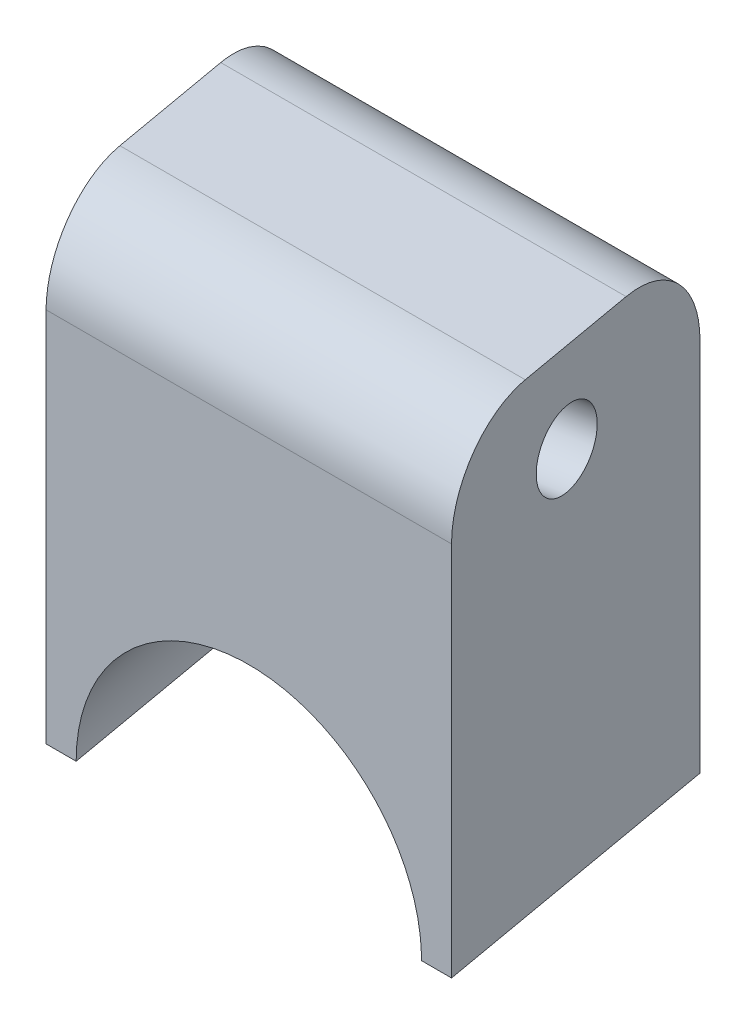
ISO-10303-21;
HEADER;
FILE_DESCRIPTION(('STEP AP214'),'2;1');
FILE_NAME('part.step','',(''),(''),'','','');
FILE_SCHEMA(('AUTOMOTIVE_DESIGN { 1 0 10303 214 1 1 1 1 }'));
ENDSEC;
DATA;
#1=APPLICATION_CONTEXT('core data for automotive mechanical design processes');
#2=APPLICATION_PROTOCOL_DEFINITION('international standard','automotive_design',2000,#1);
#3=PRODUCT_CONTEXT('',#1,'mechanical');
#4=PRODUCT('Part','Part','',(#3));
#5=PRODUCT_RELATED_PRODUCT_CATEGORY('part','',(#4));
#6=PRODUCT_DEFINITION_FORMATION('','',#4);
#7=PRODUCT_DEFINITION_CONTEXT('part definition',#1,'design');
#8=PRODUCT_DEFINITION('design','',#6,#7);
#9=PRODUCT_DEFINITION_SHAPE('','',#8);
#10=(LENGTH_UNIT() NAMED_UNIT(*) SI_UNIT(.MILLI.,.METRE.));
#11=(NAMED_UNIT(*) PLANE_ANGLE_UNIT() SI_UNIT($,.RADIAN.));
#12=(NAMED_UNIT(*) SI_UNIT($,.STERADIAN.) SOLID_ANGLE_UNIT());
#13=UNCERTAINTY_MEASURE_WITH_UNIT(LENGTH_MEASURE(1.E-05),#10,'distance_accuracy_value','');
#14=(GEOMETRIC_REPRESENTATION_CONTEXT(3) GLOBAL_UNCERTAINTY_ASSIGNED_CONTEXT((#13)) GLOBAL_UNIT_ASSIGNED_CONTEXT((#10,
#11,#12)) REPRESENTATION_CONTEXT('',''));
#15=CARTESIAN_POINT('',(0.,0.,0.));
#16=DIRECTION('',(0.,0.,1.));
#17=DIRECTION('',(1.,0.,0.));
#18=AXIS2_PLACEMENT_3D('',#15,#16,#17);
#19=CARTESIAN_POINT('',(0.,0.,0.));
#20=DIRECTION('',(0.,1.,0.));
#21=DIRECTION('',(0.,0.,1.));
#22=AXIS2_PLACEMENT_3D('',#19,#20,#21);
#23=PLANE('',#22);
#24=DIRECTION('',(0.173648177666931,0.,0.984807753012208));
#25=VECTOR('',#24,1.);
#26=CARTESIAN_POINT('',(33.0327464679226,0.,-40.30605787334));
#27=LINE('',#26,#25);
#28=CARTESIAN_POINT('',(33.9459209392839,0.,-35.1271880957697));
#29=VERTEX_POINT('',#28);
#30=CARTESIAN_POINT('',(36.9153047773884,0.,-18.2869755192609));
#31=VERTEX_POINT('',#30);
#32=EDGE_CURVE('E185',#29,#31,#27,.T.);
#33=ORIENTED_EDGE('',*,*,#32,.T.);
#34=DIRECTION('',(-1.,0.,0.));
#35=VECTOR('',#34,1.);
#36=CARTESIAN_POINT('',(57.884357590303,0.,-18.2869755192609));
#37=LINE('',#36,#35);
#38=CARTESIAN_POINT('',(35.239357590303,0.,-18.2869755192609));
#39=VERTEX_POINT('',#38);
#40=EDGE_CURVE('E140',#31,#39,#37,.T.);
#41=ORIENTED_EDGE('',*,*,#40,.T.);
#42=DIRECTION('',(0.173648177666927,0.,0.984807753012209));
#43=VECTOR('',#42,1.);
#44=CARTESIAN_POINT('',(37.3040179336186,0.,-6.57770485052927));
#45=LINE('',#44,#43);
#46=CARTESIAN_POINT('',(32.2699737521986,0.,-35.1271880957697));
#47=VERTEX_POINT('',#46);
#48=EDGE_CURVE('E153',#47,#39,#45,.T.);
#49=ORIENTED_EDGE('',*,*,#48,.F.);
#50=DIRECTION('',(1.,0.,0.));
#51=VECTOR('',#50,1.);
#52=CARTESIAN_POINT('',(0.,0.,-35.1271880957697));
#53=LINE('',#52,#51);
#54=EDGE_CURVE('E159',#47,#29,#53,.T.);
#55=ORIENTED_EDGE('',*,*,#54,.T.);
#56=EDGE_LOOP('',(#33,#41,#49,#55));
#57=FACE_BOUND('',#56,.T.);
#58=ADVANCED_FACE('F45',(#57),#23,.F.);
#59=CARTESIAN_POINT('',(37.3040179336186,26.,-6.57770485052927));
#60=DIRECTION('',(0.984807753012209,0.,-0.173648177666927));
#61=DIRECTION('',(-0.173648177666927,0.,-0.984807753012209));
#62=AXIS2_PLACEMENT_3D('',#59,#60,#61);
#63=PLANE('',#62);
#64=CARTESIAN_POINT('',(33.6704752940083,21.,-27.1845491633573));
#65=DIRECTION('',(-0.984807753012209,0.,0.173648177666927));
#66=DIRECTION('',(0.173648177666927,0.,0.984807753012209));
#67=AXIS2_PLACEMENT_3D('',#64,#65,#66);
#68=CIRCLE('',#67,2.1);
#69=CARTESIAN_POINT('',(34.0351364671089,21.,-25.1164528820317));
#70=VERTEX_POINT('',#69);
#71=EDGE_CURVE('E127',#70,#70,#68,.T.);
#72=ORIENTED_EDGE('',*,*,#71,.F.);
#73=EDGE_LOOP('',(#72));
#74=FACE_BOUND('',#73,.T.);
#75=DIRECTION('',(0.,1.,0.));
#76=VECTOR('',#75,1.);
#77=CARTESIAN_POINT('',(35.239357590303,0.,-18.2869755192609));
#78=LINE('',#77,#76);
#79=CARTESIAN_POINT('',(35.239357590303,21.,-18.2869755192609));
#80=VERTEX_POINT('',#79);
#81=EDGE_CURVE('E145',#39,#80,#78,.T.);
#82=ORIENTED_EDGE('',*,*,#81,.T.);
#83=CARTESIAN_POINT('',(34.3577226867607,21.,-23.2869755192609));
#84=DIRECTION('',(0.984807753012209,0.,-0.173648177666927));
#85=DIRECTION('',(0.173648177666927,0.,0.984807753012209));
#86=AXIS2_PLACEMENT_3D('',#83,#84,#85);
#87=ELLIPSE('',#86,5.07713305942872,5.);
#88=CARTESIAN_POINT('',(34.3577226867607,26.,-23.2869755192609));
#89=VERTEX_POINT('',#88);
#90=EDGE_CURVE('E200',#80,#89,#87,.F.);
#91=ORIENTED_EDGE('',*,*,#90,.T.);
#92=DIRECTION('',(0.173648177666927,0.,0.984807753012209));
#93=VECTOR('',#92,1.);
#94=CARTESIAN_POINT('',(37.3040179336186,26.,-6.57770485052927));
#95=LINE('',#94,#93);
#96=CARTESIAN_POINT('',(33.1516086557409,26.,-30.1271880957697));
#97=VERTEX_POINT('',#96);
#98=EDGE_CURVE('E154',#97,#89,#95,.T.);
#99=ORIENTED_EDGE('',*,*,#98,.F.);
#100=CARTESIAN_POINT('',(33.1516086557409,21.,-30.1271880957697));
#101=DIRECTION('',(0.984807753012209,0.,-0.173648177666927));
#102=DIRECTION('',(0.173648177666927,0.,0.984807753012209));
#103=AXIS2_PLACEMENT_3D('',#100,#101,#102);
#104=ELLIPSE('',#103,5.07713305942872,5.);
#105=CARTESIAN_POINT('',(32.2699737521986,21.,-35.1271880957697));
#106=VERTEX_POINT('',#105);
#107=EDGE_CURVE('E197',#97,#106,#104,.F.);
#108=ORIENTED_EDGE('',*,*,#107,.T.);
#109=DIRECTION('',(0.,-1.,0.));
#110=VECTOR('',#109,1.);
#111=CARTESIAN_POINT('',(32.2699737521986,26.,-35.1271880957697));
#112=LINE('',#111,#110);
#113=EDGE_CURVE('E162',#106,#47,#112,.T.);
#114=ORIENTED_EDGE('',*,*,#113,.T.);
#115=ORIENTED_EDGE('',*,*,#48,.T.);
#116=EDGE_LOOP('',(#82,#91,#99,#108,#114,#115));
#117=FACE_BOUND('',#116,.T.);
#118=ADVANCED_FACE('F224',(#74,#117),#63,.F.);
#119=CARTESIAN_POINT('',(59.2661876324671,26.,-10.4502279233341));
#120=DIRECTION('',(-0.984807753012209,0.,0.173648177666927));
#121=DIRECTION('',(0.173648177666927,0.,0.984807753012209));
#122=AXIS2_PLACEMENT_3D('',#119,#120,#121);
#123=PLANE('',#122);
#124=CARTESIAN_POINT('',(56.5070996456351,21.,-26.0977934617802));
#125=DIRECTION('',(0.984807753012209,0.,-0.173648177666927));
#126=DIRECTION('',(-0.173648177666927,0.,-0.984807753012209));
#127=AXIS2_PLACEMENT_3D('',#124,#125,#126);
#128=CIRCLE('',#127,2.1);
#129=CARTESIAN_POINT('',(56.1424384725346,21.,-28.1658897431058));
#130=VERTEX_POINT('',#129);
#131=EDGE_CURVE('E126',#130,#130,#128,.T.);
#132=ORIENTED_EDGE('',*,*,#131,.F.);
#133=EDGE_LOOP('',(#132));
#134=FACE_BOUND('',#133,.T.);
#135=DIRECTION('',(-0.173648177666927,0.,-0.984807753012209));
#136=VECTOR('',#135,1.);
#137=CARTESIAN_POINT('',(59.2661876324671,26.,-10.4502279233341));
#138=LINE('',#137,#136);
#139=CARTESIAN_POINT('',(57.0027226867607,26.,-23.2869755192609));
#140=VERTEX_POINT('',#139);
#141=CARTESIAN_POINT('',(55.7966086557409,26.,-30.1271880957697));
#142=VERTEX_POINT('',#141);
#143=EDGE_CURVE('E158',#140,#142,#138,.T.);
#144=ORIENTED_EDGE('',*,*,#143,.F.);
#145=CARTESIAN_POINT('',(57.0027226867607,21.,-23.2869755192609));
#146=DIRECTION('',(-0.984807753012209,0.,0.173648177666927));
#147=DIRECTION('',(0.173648177666927,0.,0.984807753012209));
#148=AXIS2_PLACEMENT_3D('',#145,#146,#147);
#149=ELLIPSE('',#148,5.07713305942872,5.);
#150=CARTESIAN_POINT('',(57.884357590303,21.,-18.2869755192609));
#151=VERTEX_POINT('',#150);
#152=EDGE_CURVE('E54',#140,#151,#149,.F.);
#153=ORIENTED_EDGE('',*,*,#152,.T.);
#154=DIRECTION('',(0.,-1.,0.));
#155=VECTOR('',#154,1.);
#156=CARTESIAN_POINT('',(57.884357590303,26.,-18.2869755192609));
#157=LINE('',#156,#155);
#158=CARTESIAN_POINT('',(57.884357590303,0.,-18.2869755192609));
#159=VERTEX_POINT('',#158);
#160=EDGE_CURVE('E179',#151,#159,#157,.T.);
#161=ORIENTED_EDGE('',*,*,#160,.T.);
#162=DIRECTION('',(-0.173648177666927,0.,-0.984807753012209));
#163=VECTOR('',#162,1.);
#164=CARTESIAN_POINT('',(59.2661876324671,0.,-10.4502279233341));
#165=LINE('',#164,#163);
#166=CARTESIAN_POINT('',(54.9149737521986,0.,-35.1271880957697));
#167=VERTEX_POINT('',#166);
#168=EDGE_CURVE('E166',#159,#167,#165,.T.);
#169=ORIENTED_EDGE('',*,*,#168,.T.);
#170=DIRECTION('',(0.,-1.,0.));
#171=VECTOR('',#170,1.);
#172=CARTESIAN_POINT('',(54.9149737521986,26.,-35.1271880957697));
#173=LINE('',#172,#171);
#174=CARTESIAN_POINT('',(54.9149737521986,21.,-35.1271880957697));
#175=VERTEX_POINT('',#174);
#176=EDGE_CURVE('E176',#175,#167,#173,.T.);
#177=ORIENTED_EDGE('',*,*,#176,.F.);
#178=CARTESIAN_POINT('',(55.7966086557409,21.,-30.1271880957697));
#179=DIRECTION('',(-0.984807753012209,0.,0.173648177666927));
#180=DIRECTION('',(0.173648177666927,0.,0.984807753012209));
#181=AXIS2_PLACEMENT_3D('',#178,#179,#180);
#182=ELLIPSE('',#181,5.07713305942872,5.);
#183=EDGE_CURVE('E61',#175,#142,#182,.F.);
#184=ORIENTED_EDGE('',*,*,#183,.T.);
#185=EDGE_LOOP('',(#144,#153,#161,#169,#177,#184));
#186=FACE_BOUND('',#185,.T.);
#187=ADVANCED_FACE('F213',(#134,#186),#123,.F.);
#188=CARTESIAN_POINT('',(0.,26.,-35.1271880957697));
#189=DIRECTION('',(0.,0.,-1.));
#190=DIRECTION('',(-1.,0.,0.));
#191=AXIS2_PLACEMENT_3D('',#188,#189,#190);
#192=PLANE('',#191);
#193=ORIENTED_EDGE('',*,*,#113,.F.);
#194=DIRECTION('',(1.,0.,0.));
#195=VECTOR('',#194,1.);
#196=CARTESIAN_POINT('',(0.,21.,-35.1271880957697));
#197=LINE('',#196,#195);
#198=EDGE_CURVE('E11',#106,#175,#197,.T.);
#199=ORIENTED_EDGE('',*,*,#198,.T.);
#200=ORIENTED_EDGE('',*,*,#176,.T.);
#201=CARTESIAN_POINT('',(53.2390265651131,0.,-35.1271880957697));
#202=VERTEX_POINT('',#201);
#203=EDGE_CURVE('E170',#202,#167,#53,.T.);
#204=ORIENTED_EDGE('',*,*,#203,.F.);
#205=CARTESIAN_POINT('',(43.5924737521985,0.,-35.1271880957697));
#206=DIRECTION('',(0.,0.,-1.));
#207=DIRECTION('',(1.,0.,0.));
#208=AXIS2_PLACEMENT_3D('',#205,#206,#207);
#209=ELLIPSE('',#208,9.64655281291458,9.5);
#210=EDGE_CURVE('E149',#29,#202,#209,.T.);
#211=ORIENTED_EDGE('',*,*,#210,.F.);
#212=ORIENTED_EDGE('',*,*,#54,.F.);
#213=EDGE_LOOP('',(#193,#199,#200,#204,#211,#212));
#214=FACE_BOUND('',#213,.T.);
#215=ADVANCED_FACE('F232',(#214),#192,.T.);
#216=CARTESIAN_POINT('',(0.,26.,0.));
#217=DIRECTION('',(0.,1.,0.));
#218=DIRECTION('',(0.,0.,1.));
#219=AXIS2_PLACEMENT_3D('',#216,#217,#218);
#220=PLANE('',#219);
#221=ORIENTED_EDGE('',*,*,#98,.T.);
#222=DIRECTION('',(-1.,0.,0.));
#223=VECTOR('',#222,1.);
#224=CARTESIAN_POINT('',(57.884357590303,26.,-23.2869755192609));
#225=LINE('',#224,#223);
#226=EDGE_CURVE('E206',#89,#140,#225,.F.);
#227=ORIENTED_EDGE('',*,*,#226,.T.);
#228=ORIENTED_EDGE('',*,*,#143,.T.);
#229=DIRECTION('',(1.,0.,0.));
#230=VECTOR('',#229,1.);
#231=CARTESIAN_POINT('',(0.,26.,-30.1271880957697));
#232=LINE('',#231,#230);
#233=EDGE_CURVE('E203',#142,#97,#232,.F.);
#234=ORIENTED_EDGE('',*,*,#233,.T.);
#235=EDGE_LOOP('',(#221,#227,#228,#234));
#236=FACE_BOUND('',#235,.T.);
#237=ADVANCED_FACE('F227',(#236),#220,.T.);
#238=ORIENTED_EDGE('',*,*,#168,.F.);
#239=CARTESIAN_POINT('',(56.2084104032176,0.,-18.2869755192609));
#240=VERTEX_POINT('',#239);
#241=EDGE_CURVE('E141',#159,#240,#37,.T.);
#242=ORIENTED_EDGE('',*,*,#241,.T.);
#243=DIRECTION('',(0.173648177666931,0.,0.984807753012208));
#244=VECTOR('',#243,1.);
#245=CARTESIAN_POINT('',(51.7440937751546,0.,-43.6053732490117));
#246=LINE('',#245,#244);
#247=EDGE_CURVE('E182',#240,#202,#246,.F.);
#248=ORIENTED_EDGE('',*,*,#247,.T.);
#249=ORIENTED_EDGE('',*,*,#203,.T.);
#250=EDGE_LOOP('',(#238,#242,#248,#249));
#251=FACE_BOUND('',#250,.T.);
#252=ADVANCED_FACE('F241',(#251),#23,.F.);
#253=CARTESIAN_POINT('',(42.3884201215386,0.,-41.9557155611759));
#254=DIRECTION('',(0.173648177666931,0.,0.984807753012208));
#255=DIRECTION('',(0.984807753012208,0.,-0.173648177666931));
#256=AXIS2_PLACEMENT_3D('',#253,#254,#255);
#257=CYLINDRICAL_SURFACE('',#256,9.5);
#258=ORIENTED_EDGE('',*,*,#247,.F.);
#259=CARTESIAN_POINT('',(46.561857590303,0.,-18.2869755192609));
#260=DIRECTION('',(0.,0.,-1.));
#261=DIRECTION('',(1.,0.,0.));
#262=AXIS2_PLACEMENT_3D('',#259,#260,#261);
#263=ELLIPSE('',#262,9.64655281291458,9.5);
#264=EDGE_CURVE('E189',#240,#31,#263,.F.);
#265=ORIENTED_EDGE('',*,*,#264,.T.);
#266=ORIENTED_EDGE('',*,*,#32,.F.);
#267=ORIENTED_EDGE('',*,*,#210,.T.);
#268=EDGE_LOOP('',(#258,#265,#266,#267));
#269=FACE_BOUND('',#268,.T.);
#270=ADVANCED_FACE('F244',(#269),#257,.F.);
#271=CARTESIAN_POINT('',(57.884357590303,0.,-18.2869755192609));
#272=DIRECTION('',(0.,0.,-1.));
#273=DIRECTION('',(-1.,0.,0.));
#274=AXIS2_PLACEMENT_3D('',#271,#272,#273);
#275=PLANE('',#274);
#276=ORIENTED_EDGE('',*,*,#160,.F.);
#277=DIRECTION('',(-1.,0.,0.));
#278=VECTOR('',#277,1.);
#279=CARTESIAN_POINT('',(35.239357590303,21.,-18.2869755192609));
#280=LINE('',#279,#278);
#281=EDGE_CURVE('E193',#151,#80,#280,.T.);
#282=ORIENTED_EDGE('',*,*,#281,.T.);
#283=ORIENTED_EDGE('',*,*,#81,.F.);
#284=ORIENTED_EDGE('',*,*,#40,.F.);
#285=ORIENTED_EDGE('',*,*,#264,.F.);
#286=ORIENTED_EDGE('',*,*,#241,.F.);
#287=EDGE_LOOP('',(#276,#282,#283,#284,#285,#286));
#288=FACE_BOUND('',#287,.T.);
#289=ADVANCED_FACE('F219',(#288),#275,.F.);
#290=CARTESIAN_POINT('',(57.884357590303,21.,-23.2869755192609));
#291=DIRECTION('',(1.,0.,0.));
#292=DIRECTION('',(0.,0.,-1.));
#293=AXIS2_PLACEMENT_3D('',#290,#291,#292);
#294=CYLINDRICAL_SURFACE('',#293,5.);
#295=ORIENTED_EDGE('',*,*,#152,.F.);
#296=ORIENTED_EDGE('',*,*,#226,.F.);
#297=ORIENTED_EDGE('',*,*,#90,.F.);
#298=ORIENTED_EDGE('',*,*,#281,.F.);
#299=EDGE_LOOP('',(#295,#296,#297,#298));
#300=FACE_BOUND('',#299,.T.);
#301=ADVANCED_FACE('F221',(#300),#294,.T.);
#302=CARTESIAN_POINT('',(0.,21.,-30.1271880957697));
#303=DIRECTION('',(1.,0.,0.));
#304=DIRECTION('',(0.,0.,-1.));
#305=AXIS2_PLACEMENT_3D('',#302,#303,#304);
#306=CYLINDRICAL_SURFACE('',#305,5.);
#307=ORIENTED_EDGE('',*,*,#107,.F.);
#308=ORIENTED_EDGE('',*,*,#233,.F.);
#309=ORIENTED_EDGE('',*,*,#183,.F.);
#310=ORIENTED_EDGE('',*,*,#198,.F.);
#311=EDGE_LOOP('',(#307,#308,#309,#310));
#312=FACE_BOUND('',#311,.T.);
#313=ADVANCED_FACE('F47',(#312),#306,.T.);
#314=CARTESIAN_POINT('',(50.5982531275619,21.,-25.0559043957786));
#315=DIRECTION('',(0.984807753012209,0.,-0.173648177666927));
#316=DIRECTION('',(-0.173648177666927,0.,-0.984807753012209));
#317=AXIS2_PLACEMENT_3D('',#314,#315,#316);
#318=CONICAL_SURFACE('',#317,2.1,1.02974425867665);
#319=CARTESIAN_POINT('',(49.355615515756,21.,-24.8367938575741));
#320=VERTEX_POINT('',#319);
#321=VERTEX_LOOP('',#320);
#322=FACE_BOUND('',#321,.T.);
#323=CARTESIAN_POINT('',(50.5982531275619,21.,-25.0559043957786));
#324=DIRECTION('',(0.984807753012209,0.,-0.173648177666927));
#325=DIRECTION('',(-0.173648177666927,0.,-0.984807753012209));
#326=AXIS2_PLACEMENT_3D('',#323,#324,#325);
#327=CIRCLE('',#326,2.1);
#328=CARTESIAN_POINT('',(50.2335919544613,21.,-27.1240006771042));
#329=VERTEX_POINT('',#328);
#330=EDGE_CURVE('E132',#329,#329,#327,.T.);
#331=ORIENTED_EDGE('',*,*,#330,.T.);
#332=EDGE_LOOP('',(#331));
#333=FACE_BOUND('',#332,.T.);
#334=ADVANCED_FACE('F269',(#322,#333),#318,.F.);
#335=CARTESIAN_POINT('',(56.5070996456351,21.,-26.0977934617802));
#336=DIRECTION('',(0.984807753012209,0.,-0.173648177666927));
#337=DIRECTION('',(-0.173648177666927,0.,-0.984807753012209));
#338=AXIS2_PLACEMENT_3D('',#335,#336,#337);
#339=CYLINDRICAL_SURFACE('',#338,2.1);
#340=ORIENTED_EDGE('',*,*,#330,.F.);
#341=EDGE_LOOP('',(#340));
#342=FACE_BOUND('',#341,.T.);
#343=ORIENTED_EDGE('',*,*,#131,.T.);
#344=EDGE_LOOP('',(#343));
#345=FACE_BOUND('',#344,.T.);
#346=ADVANCED_FACE('F119',(#342,#345),#339,.F.);
#347=CARTESIAN_POINT('',(39.5793218120816,21.,-28.2264382293589));
#348=DIRECTION('',(-0.984807753012209,0.,0.173648177666927));
#349=DIRECTION('',(0.173648177666927,0.,0.984807753012209));
#350=AXIS2_PLACEMENT_3D('',#347,#348,#349);
#351=CONICAL_SURFACE('',#350,2.1,1.02974425867665);
#352=CARTESIAN_POINT('',(40.8219594238875,21.,-28.4455487675634));
#353=VERTEX_POINT('',#352);
#354=VERTEX_LOOP('',#353);
#355=FACE_BOUND('',#354,.T.);
#356=CARTESIAN_POINT('',(39.5793218120816,21.,-28.2264382293589));
#357=DIRECTION('',(-0.984807753012209,0.,0.173648177666927));
#358=DIRECTION('',(0.173648177666927,0.,0.984807753012209));
#359=AXIS2_PLACEMENT_3D('',#356,#357,#358);
#360=CIRCLE('',#359,2.1);
#361=CARTESIAN_POINT('',(39.9439829851821,21.,-26.1583419480332));
#362=VERTEX_POINT('',#361);
#363=EDGE_CURVE('E123',#362,#362,#360,.T.);
#364=ORIENTED_EDGE('',*,*,#363,.T.);
#365=EDGE_LOOP('',(#364));
#366=FACE_BOUND('',#365,.T.);
#367=ADVANCED_FACE('F115',(#355,#366),#351,.F.);
#368=CARTESIAN_POINT('',(33.6704752940083,21.,-27.1845491633573));
#369=DIRECTION('',(-0.984807753012209,0.,0.173648177666927));
#370=DIRECTION('',(0.173648177666927,0.,0.984807753012209));
#371=AXIS2_PLACEMENT_3D('',#368,#369,#370);
#372=CYLINDRICAL_SURFACE('',#371,2.1);
#373=ORIENTED_EDGE('',*,*,#363,.F.);
#374=EDGE_LOOP('',(#373));
#375=FACE_BOUND('',#374,.T.);
#376=ORIENTED_EDGE('',*,*,#71,.T.);
#377=EDGE_LOOP('',(#376));
#378=FACE_BOUND('',#377,.T.);
#379=ADVANCED_FACE('F118',(#375,#378),#372,.F.);
#380=CLOSED_SHELL('',(#58,#118,#187,#215,#237,#252,#270,#289,#301,#313,#334,#346,#367,#379));
#381=MANIFOLD_SOLID_BREP('B2',#380);
#382=ADVANCED_BREP_SHAPE_REPRESENTATION('',(#18,#381),#14);
#383=SHAPE_DEFINITION_REPRESENTATION(#9,#382);
ENDSEC;
END-ISO-10303-21;
